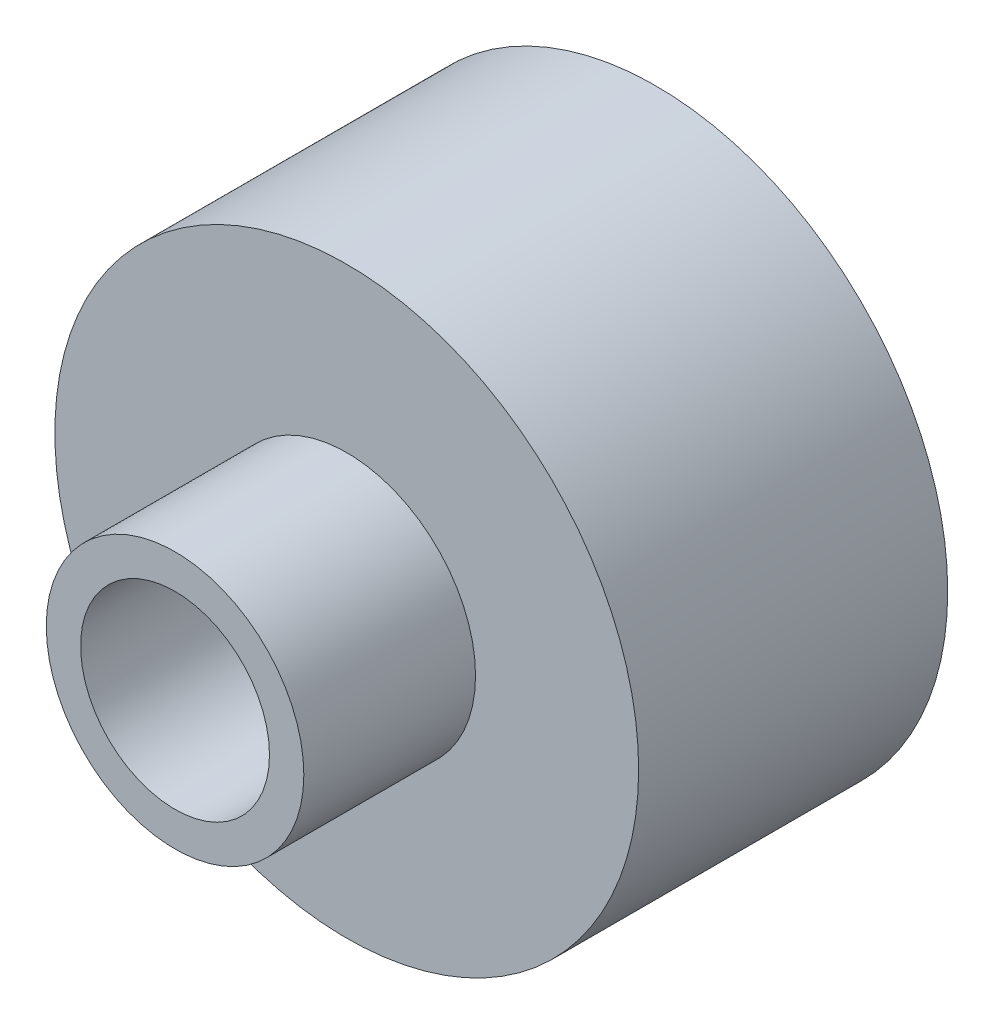
ISO-10303-21;
HEADER;
FILE_DESCRIPTION(('STEP AP214'),'2;1');
FILE_NAME('part.step','',(''),(''),'','','');
FILE_SCHEMA(('AUTOMOTIVE_DESIGN { 1 0 10303 214 1 1 1 1 }'));
ENDSEC;
DATA;
#1=APPLICATION_CONTEXT('core data for automotive mechanical design processes');
#2=APPLICATION_PROTOCOL_DEFINITION('international standard','automotive_design',2000,#1);
#3=PRODUCT_CONTEXT('',#1,'mechanical');
#4=PRODUCT('Part','Part','',(#3));
#5=PRODUCT_RELATED_PRODUCT_CATEGORY('part','',(#4));
#6=PRODUCT_DEFINITION_FORMATION('','',#4);
#7=PRODUCT_DEFINITION_CONTEXT('part definition',#1,'design');
#8=PRODUCT_DEFINITION('design','',#6,#7);
#9=PRODUCT_DEFINITION_SHAPE('','',#8);
#10=(LENGTH_UNIT() NAMED_UNIT(*) SI_UNIT(.MILLI.,.METRE.));
#11=(NAMED_UNIT(*) PLANE_ANGLE_UNIT() SI_UNIT($,.RADIAN.));
#12=(NAMED_UNIT(*) SI_UNIT($,.STERADIAN.) SOLID_ANGLE_UNIT());
#13=UNCERTAINTY_MEASURE_WITH_UNIT(LENGTH_MEASURE(1.E-05),#10,'distance_accuracy_value','');
#14=(GEOMETRIC_REPRESENTATION_CONTEXT(3) GLOBAL_UNCERTAINTY_ASSIGNED_CONTEXT((#13)) GLOBAL_UNIT_ASSIGNED_CONTEXT((#10,
#11,#12)) REPRESENTATION_CONTEXT('',''));
#15=CARTESIAN_POINT('',(0.,0.,0.));
#16=DIRECTION('',(0.,0.,1.));
#17=DIRECTION('',(1.,0.,0.));
#18=AXIS2_PLACEMENT_3D('',#15,#16,#17);
#19=CARTESIAN_POINT('',(0.,0.,0.));
#20=DIRECTION('',(0.,0.,1.));
#21=DIRECTION('',(1.,0.,0.));
#22=AXIS2_PLACEMENT_3D('',#19,#20,#21);
#23=CYLINDRICAL_SURFACE('',#22,2.75);
#24=CARTESIAN_POINT('',(0.,0.,14.));
#25=DIRECTION('',(0.,0.,1.));
#26=DIRECTION('',(1.,0.,0.));
#27=AXIS2_PLACEMENT_3D('',#24,#25,#26);
#28=CIRCLE('',#27,2.75);
#29=CARTESIAN_POINT('',(2.75,0.,14.));
#30=VERTEX_POINT('',#29);
#31=EDGE_CURVE('E10',#30,#30,#28,.T.);
#32=ORIENTED_EDGE('',*,*,#31,.T.);
#33=EDGE_LOOP('',(#32));
#34=FACE_BOUND('',#33,.T.);
#35=CARTESIAN_POINT('',(0.,0.,0.));
#36=DIRECTION('',(0.,0.,1.));
#37=DIRECTION('',(1.,0.,0.));
#38=AXIS2_PLACEMENT_3D('',#35,#36,#37);
#39=CIRCLE('',#38,2.75);
#40=CARTESIAN_POINT('',(2.75,0.,0.));
#41=VERTEX_POINT('',#40);
#42=EDGE_CURVE('E55',#41,#41,#39,.T.);
#43=ORIENTED_EDGE('',*,*,#42,.F.);
#44=EDGE_LOOP('',(#43));
#45=FACE_BOUND('',#44,.T.);
#46=ADVANCED_FACE('F33',(#34,#45),#23,.F.);
#47=CARTESIAN_POINT('',(2.75,0.,14.));
#48=DIRECTION('',(0.,0.,1.));
#49=DIRECTION('',(1.,0.,0.));
#50=AXIS2_PLACEMENT_3D('',#47,#48,#49);
#51=PLANE('',#50);
#52=CARTESIAN_POINT('',(0.,0.,14.));
#53=DIRECTION('',(0.,0.,1.));
#54=DIRECTION('',(1.,0.,0.));
#55=AXIS2_PLACEMENT_3D('',#52,#53,#54);
#56=CIRCLE('',#55,3.75);
#57=CARTESIAN_POINT('',(3.75,0.,14.));
#58=VERTEX_POINT('',#57);
#59=EDGE_CURVE('E39',#58,#58,#56,.T.);
#60=ORIENTED_EDGE('',*,*,#59,.T.);
#61=EDGE_LOOP('',(#60));
#62=FACE_BOUND('',#61,.T.);
#63=ORIENTED_EDGE('',*,*,#31,.F.);
#64=EDGE_LOOP('',(#63));
#65=FACE_BOUND('',#64,.T.);
#66=ADVANCED_FACE('F63',(#62,#65),#51,.T.);
#67=CARTESIAN_POINT('',(0.,0.,0.));
#68=DIRECTION('',(0.,0.,1.));
#69=DIRECTION('',(1.,0.,0.));
#70=AXIS2_PLACEMENT_3D('',#67,#68,#69);
#71=CYLINDRICAL_SURFACE('',#70,3.75);
#72=CARTESIAN_POINT('',(0.,0.,9.));
#73=DIRECTION('',(0.,0.,1.));
#74=DIRECTION('',(1.,0.,0.));
#75=AXIS2_PLACEMENT_3D('',#72,#73,#74);
#76=CIRCLE('',#75,3.75);
#77=CARTESIAN_POINT('',(3.75,0.,9.));
#78=VERTEX_POINT('',#77);
#79=EDGE_CURVE('E43',#78,#78,#76,.T.);
#80=ORIENTED_EDGE('',*,*,#79,.T.);
#81=EDGE_LOOP('',(#80));
#82=FACE_BOUND('',#81,.T.);
#83=ORIENTED_EDGE('',*,*,#59,.F.);
#84=EDGE_LOOP('',(#83));
#85=FACE_BOUND('',#84,.T.);
#86=ADVANCED_FACE('F67',(#82,#85),#71,.T.);
#87=CARTESIAN_POINT('',(3.75,0.,9.));
#88=DIRECTION('',(0.,0.,1.));
#89=DIRECTION('',(1.,0.,0.));
#90=AXIS2_PLACEMENT_3D('',#87,#88,#89);
#91=PLANE('',#90);
#92=CARTESIAN_POINT('',(0.,0.,9.));
#93=DIRECTION('',(0.,0.,1.));
#94=DIRECTION('',(1.,0.,0.));
#95=AXIS2_PLACEMENT_3D('',#92,#93,#94);
#96=CIRCLE('',#95,8.5);
#97=CARTESIAN_POINT('',(8.5,0.,9.));
#98=VERTEX_POINT('',#97);
#99=EDGE_CURVE('E47',#98,#98,#96,.T.);
#100=ORIENTED_EDGE('',*,*,#99,.T.);
#101=EDGE_LOOP('',(#100));
#102=FACE_BOUND('',#101,.T.);
#103=ORIENTED_EDGE('',*,*,#79,.F.);
#104=EDGE_LOOP('',(#103));
#105=FACE_BOUND('',#104,.T.);
#106=ADVANCED_FACE('F71',(#102,#105),#91,.T.);
#107=CARTESIAN_POINT('',(0.,0.,0.));
#108=DIRECTION('',(0.,0.,1.));
#109=DIRECTION('',(1.,0.,0.));
#110=AXIS2_PLACEMENT_3D('',#107,#108,#109);
#111=CYLINDRICAL_SURFACE('',#110,8.5);
#112=CARTESIAN_POINT('',(0.,0.,0.));
#113=DIRECTION('',(0.,0.,1.));
#114=DIRECTION('',(1.,0.,0.));
#115=AXIS2_PLACEMENT_3D('',#112,#113,#114);
#116=CIRCLE('',#115,8.5);
#117=CARTESIAN_POINT('',(8.5,0.,0.));
#118=VERTEX_POINT('',#117);
#119=EDGE_CURVE('E52',#118,#118,#116,.T.);
#120=ORIENTED_EDGE('',*,*,#119,.T.);
#121=EDGE_LOOP('',(#120));
#122=FACE_BOUND('',#121,.T.);
#123=ORIENTED_EDGE('',*,*,#99,.F.);
#124=EDGE_LOOP('',(#123));
#125=FACE_BOUND('',#124,.T.);
#126=ADVANCED_FACE('F78',(#122,#125),#111,.T.);
#127=CARTESIAN_POINT('',(8.5,0.,0.));
#128=DIRECTION('',(0.,0.,-1.));
#129=DIRECTION('',(-1.,0.,0.));
#130=AXIS2_PLACEMENT_3D('',#127,#128,#129);
#131=PLANE('',#130);
#132=ORIENTED_EDGE('',*,*,#42,.T.);
#133=EDGE_LOOP('',(#132));
#134=FACE_BOUND('',#133,.T.);
#135=ORIENTED_EDGE('',*,*,#119,.F.);
#136=EDGE_LOOP('',(#135));
#137=FACE_BOUND('',#136,.T.);
#138=ADVANCED_FACE('F59',(#134,#137),#131,.T.);
#139=CLOSED_SHELL('',(#46,#66,#86,#106,#126,#138));
#140=MANIFOLD_SOLID_BREP('B2',#139);
#141=ADVANCED_BREP_SHAPE_REPRESENTATION('',(#18,#140),#14);
#142=SHAPE_DEFINITION_REPRESENTATION(#9,#141);
ENDSEC;
END-ISO-10303-21;
